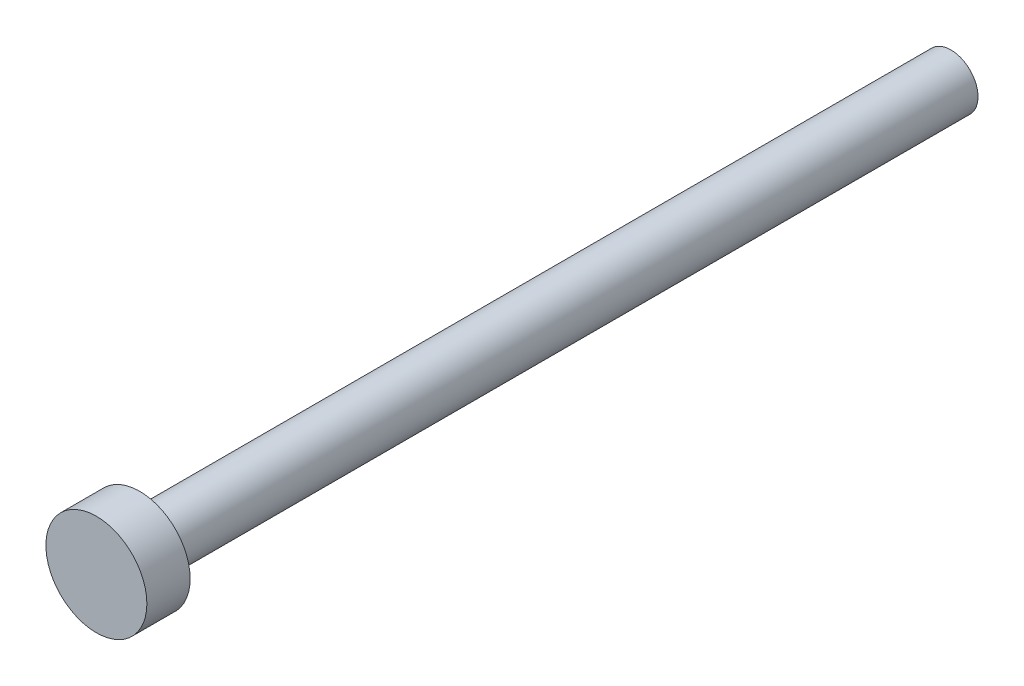
ISO-10303-21;
HEADER;
FILE_DESCRIPTION(('STEP AP214'),'2;1');
FILE_NAME('part.step','',(''),(''),'','','');
FILE_SCHEMA(('AUTOMOTIVE_DESIGN { 1 0 10303 214 1 1 1 1 }'));
ENDSEC;
DATA;
#1=APPLICATION_CONTEXT('core data for automotive mechanical design processes');
#2=APPLICATION_PROTOCOL_DEFINITION('international standard','automotive_design',2000,#1);
#3=PRODUCT_CONTEXT('',#1,'mechanical');
#4=PRODUCT('Part','Part','',(#3));
#5=PRODUCT_RELATED_PRODUCT_CATEGORY('part','',(#4));
#6=PRODUCT_DEFINITION_FORMATION('','',#4);
#7=PRODUCT_DEFINITION_CONTEXT('part definition',#1,'design');
#8=PRODUCT_DEFINITION('design','',#6,#7);
#9=PRODUCT_DEFINITION_SHAPE('','',#8);
#10=(LENGTH_UNIT() NAMED_UNIT(*) SI_UNIT(.MILLI.,.METRE.));
#11=(NAMED_UNIT(*) PLANE_ANGLE_UNIT() SI_UNIT($,.RADIAN.));
#12=(NAMED_UNIT(*) SI_UNIT($,.STERADIAN.) SOLID_ANGLE_UNIT());
#13=UNCERTAINTY_MEASURE_WITH_UNIT(LENGTH_MEASURE(1.E-05),#10,'distance_accuracy_value','');
#14=(GEOMETRIC_REPRESENTATION_CONTEXT(3) GLOBAL_UNCERTAINTY_ASSIGNED_CONTEXT((#13)) GLOBAL_UNIT_ASSIGNED_CONTEXT((#10,
#11,#12)) REPRESENTATION_CONTEXT('',''));
#15=CARTESIAN_POINT('',(0.,0.,0.));
#16=DIRECTION('',(0.,0.,1.));
#17=DIRECTION('',(1.,0.,0.));
#18=AXIS2_PLACEMENT_3D('',#15,#16,#17);
#19=CARTESIAN_POINT('',(0.,0.,2.4));
#20=DIRECTION('',(0.,0.,-1.));
#21=DIRECTION('',(-1.,0.,0.));
#22=AXIS2_PLACEMENT_3D('',#19,#20,#21);
#23=CYLINDRICAL_SURFACE('',#22,2.8);
#24=CARTESIAN_POINT('',(0.,0.,2.4));
#25=DIRECTION('',(0.,0.,1.));
#26=DIRECTION('',(1.,0.,0.));
#27=AXIS2_PLACEMENT_3D('',#24,#25,#26);
#28=CIRCLE('',#27,2.8);
#29=CARTESIAN_POINT('',(2.8,0.,2.4));
#30=VERTEX_POINT('',#29);
#31=EDGE_CURVE('E38',#30,#30,#28,.T.);
#32=ORIENTED_EDGE('',*,*,#31,.F.);
#33=EDGE_LOOP('',(#32));
#34=FACE_BOUND('',#33,.T.);
#35=CARTESIAN_POINT('',(0.,0.,0.));
#36=DIRECTION('',(0.,0.,1.));
#37=DIRECTION('',(1.,0.,0.));
#38=AXIS2_PLACEMENT_3D('',#35,#36,#37);
#39=CIRCLE('',#38,2.8);
#40=CARTESIAN_POINT('',(2.8,0.,0.));
#41=VERTEX_POINT('',#40);
#42=EDGE_CURVE('E34',#41,#41,#39,.T.);
#43=ORIENTED_EDGE('',*,*,#42,.T.);
#44=EDGE_LOOP('',(#43));
#45=FACE_BOUND('',#44,.T.);
#46=ADVANCED_FACE('F31',(#34,#45),#23,.T.);
#47=CARTESIAN_POINT('',(0.,0.,2.4));
#48=DIRECTION('',(0.,0.,1.));
#49=DIRECTION('',(1.,0.,0.));
#50=AXIS2_PLACEMENT_3D('',#47,#48,#49);
#51=PLANE('',#50);
#52=ORIENTED_EDGE('',*,*,#31,.T.);
#53=EDGE_LOOP('',(#52));
#54=FACE_BOUND('',#53,.T.);
#55=ADVANCED_FACE('F55',(#54),#51,.T.);
#56=CARTESIAN_POINT('',(0.,0.,0.));
#57=DIRECTION('',(0.,0.,1.));
#58=DIRECTION('',(1.,0.,0.));
#59=AXIS2_PLACEMENT_3D('',#56,#57,#58);
#60=PLANE('',#59);
#61=CARTESIAN_POINT('',(0.,0.,0.));
#62=DIRECTION('',(0.,0.,-1.));
#63=DIRECTION('',(-1.,0.,0.));
#64=AXIS2_PLACEMENT_3D('',#61,#62,#63);
#65=CIRCLE('',#64,1.5);
#66=CARTESIAN_POINT('',(1.5,0.,0.));
#67=VERTEX_POINT('',#66);
#68=EDGE_CURVE('E10',#67,#67,#65,.T.);
#69=ORIENTED_EDGE('',*,*,#68,.F.);
#70=EDGE_LOOP('',(#69));
#71=FACE_BOUND('',#70,.T.);
#72=ORIENTED_EDGE('',*,*,#42,.F.);
#73=EDGE_LOOP('',(#72));
#74=FACE_BOUND('',#73,.T.);
#75=ADVANCED_FACE('F52',(#71,#74),#60,.F.);
#76=CARTESIAN_POINT('',(0.,0.,-45.));
#77=DIRECTION('',(0.,0.,1.));
#78=DIRECTION('',(1.,0.,0.));
#79=AXIS2_PLACEMENT_3D('',#76,#77,#78);
#80=CYLINDRICAL_SURFACE('',#79,1.5);
#81=CARTESIAN_POINT('',(0.,0.,-45.));
#82=DIRECTION('',(0.,0.,-1.));
#83=DIRECTION('',(-1.,0.,0.));
#84=AXIS2_PLACEMENT_3D('',#81,#82,#83);
#85=CIRCLE('',#84,1.5);
#86=CARTESIAN_POINT('',(1.5,0.,-45.));
#87=VERTEX_POINT('',#86);
#88=EDGE_CURVE('E44',#87,#87,#85,.T.);
#89=CARTESIAN_POINT('',(1.5,0.,-45.));
#90=CARTESIAN_POINT('',(1.5,0.,-44.53125));
#91=CARTESIAN_POINT('',(1.5,0.,-44.0625));
#92=CARTESIAN_POINT('',(1.5,0.,-43.125));
#93=CARTESIAN_POINT('',(1.5,0.,-42.65625));
#94=CARTESIAN_POINT('',(1.5,0.,-41.71875));
#95=CARTESIAN_POINT('',(1.5,0.,-41.25));
#96=CARTESIAN_POINT('',(1.5,0.,-40.3125));
#97=CARTESIAN_POINT('',(1.5,0.,-39.84375));
#98=CARTESIAN_POINT('',(1.5,0.,-38.90625));
#99=CARTESIAN_POINT('',(1.5,0.,-38.4375));
#100=CARTESIAN_POINT('',(1.5,0.,-37.5));
#101=CARTESIAN_POINT('',(1.5,0.,-37.03125));
#102=CARTESIAN_POINT('',(1.5,0.,-36.09375));
#103=CARTESIAN_POINT('',(1.5,0.,-35.625));
#104=CARTESIAN_POINT('',(1.5,0.,-34.6875));
#105=CARTESIAN_POINT('',(1.5,0.,-34.21875));
#106=CARTESIAN_POINT('',(1.5,0.,-33.28125));
#107=CARTESIAN_POINT('',(1.5,0.,-32.8125));
#108=CARTESIAN_POINT('',(1.5,0.,-31.875));
#109=CARTESIAN_POINT('',(1.5,0.,-31.40625));
#110=CARTESIAN_POINT('',(1.5,0.,-30.46875));
#111=CARTESIAN_POINT('',(1.5,0.,-30.));
#112=CARTESIAN_POINT('',(1.5,0.,-29.0625));
#113=CARTESIAN_POINT('',(1.5,0.,-28.59375));
#114=CARTESIAN_POINT('',(1.5,0.,-27.65625));
#115=CARTESIAN_POINT('',(1.5,0.,-27.1875));
#116=CARTESIAN_POINT('',(1.5,0.,-26.25));
#117=CARTESIAN_POINT('',(1.5,0.,-25.78125));
#118=CARTESIAN_POINT('',(1.5,0.,-24.84375));
#119=CARTESIAN_POINT('',(1.5,0.,-24.375));
#120=CARTESIAN_POINT('',(1.5,0.,-23.4375));
#121=CARTESIAN_POINT('',(1.5,0.,-22.96875));
#122=CARTESIAN_POINT('',(1.5,0.,-22.03125));
#123=CARTESIAN_POINT('',(1.5,0.,-21.5625));
#124=CARTESIAN_POINT('',(1.5,0.,-20.625));
#125=CARTESIAN_POINT('',(1.5,0.,-20.15625));
#126=CARTESIAN_POINT('',(1.5,0.,-19.21875));
#127=CARTESIAN_POINT('',(1.5,0.,-18.75));
#128=CARTESIAN_POINT('',(1.5,0.,-17.8125));
#129=CARTESIAN_POINT('',(1.5,0.,-17.34375));
#130=CARTESIAN_POINT('',(1.5,0.,-16.40625));
#131=CARTESIAN_POINT('',(1.5,0.,-15.9375));
#132=CARTESIAN_POINT('',(1.5,0.,-15.));
#133=CARTESIAN_POINT('',(1.5,0.,-14.53125));
#134=CARTESIAN_POINT('',(1.5,0.,-13.59375));
#135=CARTESIAN_POINT('',(1.5,0.,-13.125));
#136=CARTESIAN_POINT('',(1.5,0.,-12.1875));
#137=CARTESIAN_POINT('',(1.5,0.,-11.71875));
#138=CARTESIAN_POINT('',(1.5,0.,-10.78125));
#139=CARTESIAN_POINT('',(1.5,0.,-10.3125));
#140=CARTESIAN_POINT('',(1.5,0.,-9.37499999999999));
#141=CARTESIAN_POINT('',(1.5,0.,-8.90624999999999));
#142=CARTESIAN_POINT('',(1.5,0.,-7.96874999999999));
#143=CARTESIAN_POINT('',(1.5,0.,-7.5));
#144=CARTESIAN_POINT('',(1.5,0.,-6.56249999999999));
#145=CARTESIAN_POINT('',(1.5,0.,-6.09374999999999));
#146=CARTESIAN_POINT('',(1.5,0.,-5.15624999999999));
#147=CARTESIAN_POINT('',(1.5,0.,-4.68749999999999));
#148=CARTESIAN_POINT('',(1.5,0.,-3.74999999999999));
#149=CARTESIAN_POINT('',(1.5,0.,-3.28124999999999));
#150=CARTESIAN_POINT('',(1.5,0.,-2.34374999999999));
#151=CARTESIAN_POINT('',(1.5,0.,-1.87499999999999));
#152=CARTESIAN_POINT('',(1.5,0.,-0.937499999999992));
#153=CARTESIAN_POINT('',(1.5,0.,-0.468749999999993));
#154=CARTESIAN_POINT('',(1.5,0.,0.));
#155=B_SPLINE_CURVE_WITH_KNOTS('',3,(#89,#90,#91,#92,#93,#94,#95,#96,#97,#98,#99,#100,#101,#102,
#103,#104,#105,#106,#107,#108,#109,#110,#111,#112,#113,#114,#115,#116,#117,#118,#119,#120,#121,
#122,#123,#124,#125,#126,#127,#128,#129,#130,#131,#132,#133,#134,#135,#136,#137,#138,#139,#140,
#141,#142,#143,#144,#145,#146,#147,#148,#149,#150,#151,#152,#153,#154),.UNSPECIFIED.,.F.,.F.,(4,
2,2,2,2,2,2,2,2,2,2,2,2,2,2,2,2,2,2,2,2,2,2,2,2,2,2,2,2,2,2,2,4),(0.,1.40625,2.8125,
4.21874999999999,5.625,7.03125,8.43749999999999,9.84375,11.25,12.65625,14.0625,15.46875,16.875,
18.28125,19.6875,21.09375,22.5,23.90625,25.3125,26.71875,28.125,29.53125,30.9375,32.34375,33.75,
35.15625,36.5625,37.96875,39.375,40.78125,42.1875,43.59375,45.),.UNSPECIFIED.);
#156=EDGE_CURVE('BSEAM54',#87,#67,#155,.T.);
#157=ORIENTED_EDGE('',*,*,#88,.F.);
#158=ORIENTED_EDGE('',*,*,#68,.T.);
#159=ORIENTED_EDGE('',*,*,#156,.T.);
#160=ORIENTED_EDGE('',*,*,#156,.F.);
#161=EDGE_LOOP('',(#157,#159,#158,#160));
#162=FACE_BOUND('',#161,.T.);
#163=ADVANCED_FACE('F54',(#162),#80,.T.);
#164=CARTESIAN_POINT('',(0.,0.,-45.));
#165=DIRECTION('',(0.,0.,-1.));
#166=DIRECTION('',(-1.,0.,0.));
#167=AXIS2_PLACEMENT_3D('',#164,#165,#166);
#168=PLANE('',#167);
#169=ORIENTED_EDGE('',*,*,#88,.T.);
#170=EDGE_LOOP('',(#169));
#171=FACE_BOUND('',#170,.T.);
#172=ADVANCED_FACE('F61',(#171),#168,.T.);
#173=CLOSED_SHELL('',(#46,#55,#75,#163,#172));
#174=MANIFOLD_SOLID_BREP('B2',#173);
#175=ADVANCED_BREP_SHAPE_REPRESENTATION('',(#18,#174),#14);
#176=SHAPE_DEFINITION_REPRESENTATION(#9,#175);
ENDSEC;
END-ISO-10303-21;
